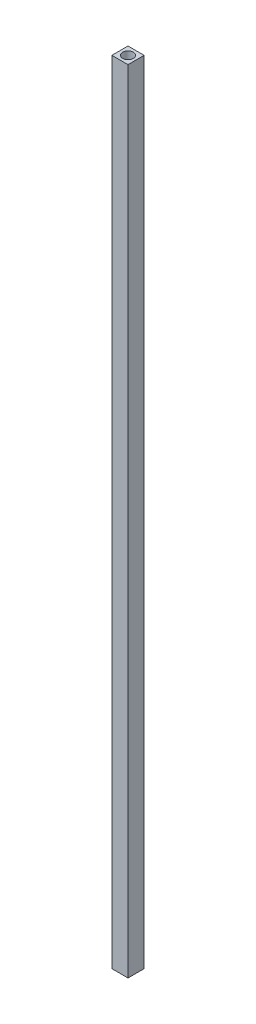
ISO-10303-21;
HEADER;
FILE_DESCRIPTION(('STEP AP214'),'2;1');
FILE_NAME('part.step','',(''),(''),'','','');
FILE_SCHEMA(('AUTOMOTIVE_DESIGN { 1 0 10303 214 1 1 1 1 }'));
ENDSEC;
DATA;
#1=APPLICATION_CONTEXT('core data for automotive mechanical design processes');
#2=APPLICATION_PROTOCOL_DEFINITION('international standard','automotive_design',2000,#1);
#3=PRODUCT_CONTEXT('',#1,'mechanical');
#4=PRODUCT('Part','Part','',(#3));
#5=PRODUCT_RELATED_PRODUCT_CATEGORY('part','',(#4));
#6=PRODUCT_DEFINITION_FORMATION('','',#4);
#7=PRODUCT_DEFINITION_CONTEXT('part definition',#1,'design');
#8=PRODUCT_DEFINITION('design','',#6,#7);
#9=PRODUCT_DEFINITION_SHAPE('','',#8);
#10=(LENGTH_UNIT() NAMED_UNIT(*) SI_UNIT(.MILLI.,.METRE.));
#11=(NAMED_UNIT(*) PLANE_ANGLE_UNIT() SI_UNIT($,.RADIAN.));
#12=(NAMED_UNIT(*) SI_UNIT($,.STERADIAN.) SOLID_ANGLE_UNIT());
#13=UNCERTAINTY_MEASURE_WITH_UNIT(LENGTH_MEASURE(1.E-05),#10,'distance_accuracy_value','');
#14=(GEOMETRIC_REPRESENTATION_CONTEXT(3) GLOBAL_UNCERTAINTY_ASSIGNED_CONTEXT((#13)) GLOBAL_UNIT_ASSIGNED_CONTEXT((#10,
#11,#12)) REPRESENTATION_CONTEXT('',''));
#15=CARTESIAN_POINT('',(0.,0.,0.));
#16=DIRECTION('',(0.,0.,1.));
#17=DIRECTION('',(1.,0.,0.));
#18=AXIS2_PLACEMENT_3D('',#15,#16,#17);
#19=CARTESIAN_POINT('',(0.,147.,0.));
#20=DIRECTION('',(0.,1.,0.));
#21=DIRECTION('',(0.,0.,1.));
#22=AXIS2_PLACEMENT_3D('',#19,#20,#21);
#23=PLANE('',#22);
#24=DIRECTION('',(0.,0.,1.));
#25=VECTOR('',#24,1.);
#26=CARTESIAN_POINT('',(0.,147.,0.));
#27=LINE('',#26,#25);
#28=CARTESIAN_POINT('',(0.,147.,0.));
#29=VERTEX_POINT('',#28);
#30=CARTESIAN_POINT('',(0.,147.,3.));
#31=VERTEX_POINT('',#30);
#32=EDGE_CURVE('E93',#29,#31,#27,.T.);
#33=ORIENTED_EDGE('',*,*,#32,.T.);
#34=DIRECTION('',(1.,0.,0.));
#35=VECTOR('',#34,1.);
#36=CARTESIAN_POINT('',(0.,147.,3.));
#37=LINE('',#36,#35);
#38=CARTESIAN_POINT('',(3.,147.,3.));
#39=VERTEX_POINT('',#38);
#40=EDGE_CURVE('E88',#31,#39,#37,.T.);
#41=ORIENTED_EDGE('',*,*,#40,.T.);
#42=DIRECTION('',(0.,0.,-1.));
#43=VECTOR('',#42,1.);
#44=CARTESIAN_POINT('',(3.,147.,0.));
#45=LINE('',#44,#43);
#46=CARTESIAN_POINT('',(3.,147.,0.));
#47=VERTEX_POINT('',#46);
#48=EDGE_CURVE('E91',#39,#47,#45,.T.);
#49=ORIENTED_EDGE('',*,*,#48,.T.);
#50=DIRECTION('',(-1.,0.,0.));
#51=VECTOR('',#50,1.);
#52=CARTESIAN_POINT('',(0.,147.,0.));
#53=LINE('',#52,#51);
#54=EDGE_CURVE('E58',#47,#29,#53,.T.);
#55=ORIENTED_EDGE('',*,*,#54,.T.);
#56=EDGE_LOOP('',(#33,#41,#49,#55));
#57=FACE_BOUND('',#56,.T.);
#58=CARTESIAN_POINT('',(1.5,147.,1.5));
#59=DIRECTION('',(0.,1.,0.));
#60=DIRECTION('',(0.,0.,1.));
#61=AXIS2_PLACEMENT_3D('',#58,#59,#60);
#62=CIRCLE('',#61,1.);
#63=CARTESIAN_POINT('',(1.5,147.,2.5));
#64=VERTEX_POINT('',#63);
#65=EDGE_CURVE('E108',#64,#64,#62,.T.);
#66=ORIENTED_EDGE('',*,*,#65,.F.);
#67=EDGE_LOOP('',(#66));
#68=FACE_BOUND('',#67,.T.);
#69=ADVANCED_FACE('F41',(#57,#68),#23,.T.);
#70=CARTESIAN_POINT('',(0.,0.,0.));
#71=DIRECTION('',(0.,1.,0.));
#72=DIRECTION('',(0.,0.,1.));
#73=AXIS2_PLACEMENT_3D('',#70,#71,#72);
#74=PLANE('',#73);
#75=DIRECTION('',(0.,0.,1.));
#76=VECTOR('',#75,1.);
#77=CARTESIAN_POINT('',(0.,0.,0.));
#78=LINE('',#77,#76);
#79=CARTESIAN_POINT('',(0.,0.,0.));
#80=VERTEX_POINT('',#79);
#81=CARTESIAN_POINT('',(0.,0.,3.));
#82=VERTEX_POINT('',#81);
#83=EDGE_CURVE('E105',#80,#82,#78,.T.);
#84=ORIENTED_EDGE('',*,*,#83,.F.);
#85=DIRECTION('',(-1.,0.,0.));
#86=VECTOR('',#85,1.);
#87=CARTESIAN_POINT('',(0.,0.,0.));
#88=LINE('',#87,#86);
#89=CARTESIAN_POINT('',(3.,0.,0.));
#90=VERTEX_POINT('',#89);
#91=EDGE_CURVE('E81',#90,#80,#88,.T.);
#92=ORIENTED_EDGE('',*,*,#91,.F.);
#93=DIRECTION('',(0.,0.,-1.));
#94=VECTOR('',#93,1.);
#95=CARTESIAN_POINT('',(3.,0.,0.));
#96=LINE('',#95,#94);
#97=CARTESIAN_POINT('',(3.,0.,3.));
#98=VERTEX_POINT('',#97);
#99=EDGE_CURVE('E75',#98,#90,#96,.T.);
#100=ORIENTED_EDGE('',*,*,#99,.F.);
#101=DIRECTION('',(1.,0.,0.));
#102=VECTOR('',#101,1.);
#103=CARTESIAN_POINT('',(0.,0.,3.));
#104=LINE('',#103,#102);
#105=EDGE_CURVE('E97',#82,#98,#104,.T.);
#106=ORIENTED_EDGE('',*,*,#105,.F.);
#107=EDGE_LOOP('',(#84,#92,#100,#106));
#108=FACE_BOUND('',#107,.T.);
#109=CARTESIAN_POINT('',(1.5,0.,1.5));
#110=DIRECTION('',(0.,1.,0.));
#111=DIRECTION('',(0.,0.,1.));
#112=AXIS2_PLACEMENT_3D('',#109,#110,#111);
#113=CIRCLE('',#112,1.);
#114=CARTESIAN_POINT('',(1.5,0.,2.5));
#115=VERTEX_POINT('',#114);
#116=EDGE_CURVE('E120',#115,#115,#113,.T.);
#117=ORIENTED_EDGE('',*,*,#116,.T.);
#118=EDGE_LOOP('',(#117));
#119=FACE_BOUND('',#118,.T.);
#120=ADVANCED_FACE('F116',(#108,#119),#74,.F.);
#121=CARTESIAN_POINT('',(0.,147.,0.));
#122=DIRECTION('',(1.,0.,0.));
#123=DIRECTION('',(0.,0.,-1.));
#124=AXIS2_PLACEMENT_3D('',#121,#122,#123);
#125=PLANE('',#124);
#126=ORIENTED_EDGE('',*,*,#83,.T.);
#127=DIRECTION('',(0.,-1.,0.));
#128=VECTOR('',#127,1.);
#129=CARTESIAN_POINT('',(0.,147.,3.));
#130=LINE('',#129,#128);
#131=EDGE_CURVE('E11',#31,#82,#130,.T.);
#132=ORIENTED_EDGE('',*,*,#131,.F.);
#133=ORIENTED_EDGE('',*,*,#32,.F.);
#134=DIRECTION('',(0.,-1.,0.));
#135=VECTOR('',#134,1.);
#136=CARTESIAN_POINT('',(0.,147.,0.));
#137=LINE('',#136,#135);
#138=EDGE_CURVE('E101',#29,#80,#137,.T.);
#139=ORIENTED_EDGE('',*,*,#138,.T.);
#140=EDGE_LOOP('',(#126,#132,#133,#139));
#141=FACE_BOUND('',#140,.T.);
#142=ADVANCED_FACE('F43',(#141),#125,.F.);
#143=CARTESIAN_POINT('',(0.,147.,3.));
#144=DIRECTION('',(0.,0.,-1.));
#145=DIRECTION('',(-1.,0.,0.));
#146=AXIS2_PLACEMENT_3D('',#143,#144,#145);
#147=PLANE('',#146);
#148=ORIENTED_EDGE('',*,*,#105,.T.);
#149=DIRECTION('',(0.,-1.,0.));
#150=VECTOR('',#149,1.);
#151=CARTESIAN_POINT('',(3.,147.,3.));
#152=LINE('',#151,#150);
#153=EDGE_CURVE('E50',#39,#98,#152,.T.);
#154=ORIENTED_EDGE('',*,*,#153,.F.);
#155=ORIENTED_EDGE('',*,*,#40,.F.);
#156=ORIENTED_EDGE('',*,*,#131,.T.);
#157=EDGE_LOOP('',(#148,#154,#155,#156));
#158=FACE_BOUND('',#157,.T.);
#159=ADVANCED_FACE('F96',(#158),#147,.F.);
#160=CARTESIAN_POINT('',(3.,147.,0.));
#161=DIRECTION('',(-1.,0.,0.));
#162=DIRECTION('',(0.,0.,1.));
#163=AXIS2_PLACEMENT_3D('',#160,#161,#162);
#164=PLANE('',#163);
#165=ORIENTED_EDGE('',*,*,#99,.T.);
#166=DIRECTION('',(0.,-1.,0.));
#167=VECTOR('',#166,1.);
#168=CARTESIAN_POINT('',(3.,147.,0.));
#169=LINE('',#168,#167);
#170=EDGE_CURVE('E98',#47,#90,#169,.T.);
#171=ORIENTED_EDGE('',*,*,#170,.F.);
#172=ORIENTED_EDGE('',*,*,#48,.F.);
#173=ORIENTED_EDGE('',*,*,#153,.T.);
#174=EDGE_LOOP('',(#165,#171,#172,#173));
#175=FACE_BOUND('',#174,.T.);
#176=ADVANCED_FACE('F99',(#175),#164,.F.);
#177=CARTESIAN_POINT('',(0.,147.,0.));
#178=DIRECTION('',(0.,0.,1.));
#179=DIRECTION('',(1.,0.,0.));
#180=AXIS2_PLACEMENT_3D('',#177,#178,#179);
#181=PLANE('',#180);
#182=ORIENTED_EDGE('',*,*,#91,.T.);
#183=ORIENTED_EDGE('',*,*,#138,.F.);
#184=ORIENTED_EDGE('',*,*,#54,.F.);
#185=ORIENTED_EDGE('',*,*,#170,.T.);
#186=EDGE_LOOP('',(#182,#183,#184,#185));
#187=FACE_BOUND('',#186,.T.);
#188=ADVANCED_FACE('F113',(#187),#181,.F.);
#189=CARTESIAN_POINT('',(1.5,147.,1.5));
#190=DIRECTION('',(0.,-1.,0.));
#191=DIRECTION('',(0.,0.,-1.));
#192=AXIS2_PLACEMENT_3D('',#189,#190,#191);
#193=CYLINDRICAL_SURFACE('',#192,1.);
#194=ORIENTED_EDGE('',*,*,#65,.T.);
#195=EDGE_LOOP('',(#194));
#196=FACE_BOUND('',#195,.T.);
#197=ORIENTED_EDGE('',*,*,#116,.F.);
#198=EDGE_LOOP('',(#197));
#199=FACE_BOUND('',#198,.T.);
#200=ADVANCED_FACE('F126',(#196,#199),#193,.F.);
#201=CLOSED_SHELL('',(#69,#120,#142,#159,#176,#188,#200));
#202=MANIFOLD_SOLID_BREP('B2',#201);
#203=ADVANCED_BREP_SHAPE_REPRESENTATION('',(#18,#202),#14);
#204=SHAPE_DEFINITION_REPRESENTATION(#9,#203);
ENDSEC;
END-ISO-10303-21;
